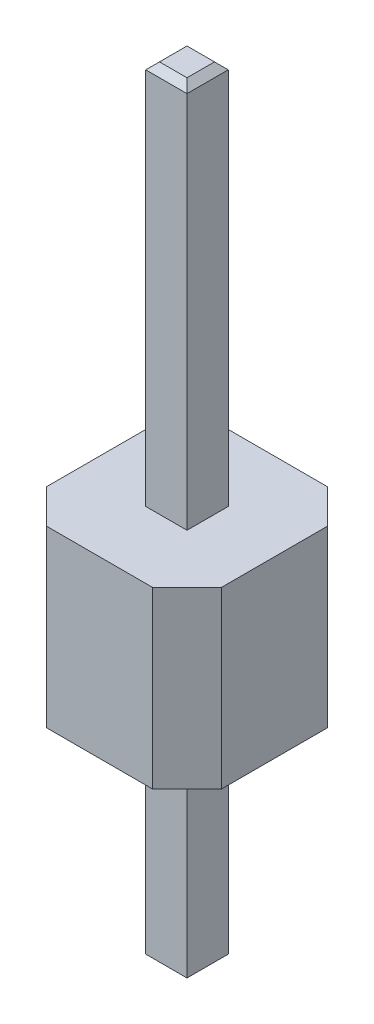
ISO-10303-21;
HEADER;
FILE_DESCRIPTION(('STEP AP214'),'2;1');
FILE_NAME('part.step','',(''),(''),'','','');
FILE_SCHEMA(('AUTOMOTIVE_DESIGN { 1 0 10303 214 1 1 1 1 }'));
ENDSEC;
DATA;
#1=APPLICATION_CONTEXT('core data for automotive mechanical design processes');
#2=APPLICATION_PROTOCOL_DEFINITION('international standard','automotive_design',2000,#1);
#3=PRODUCT_CONTEXT('',#1,'mechanical');
#4=PRODUCT('Part','Part','',(#3));
#5=PRODUCT_RELATED_PRODUCT_CATEGORY('part','',(#4));
#6=PRODUCT_DEFINITION_FORMATION('','',#4);
#7=PRODUCT_DEFINITION_CONTEXT('part definition',#1,'design');
#8=PRODUCT_DEFINITION('design','',#6,#7);
#9=PRODUCT_DEFINITION_SHAPE('','',#8);
#10=(LENGTH_UNIT() NAMED_UNIT(*) SI_UNIT(.MILLI.,.METRE.));
#11=(NAMED_UNIT(*) PLANE_ANGLE_UNIT() SI_UNIT($,.RADIAN.));
#12=(NAMED_UNIT(*) SI_UNIT($,.STERADIAN.) SOLID_ANGLE_UNIT());
#13=UNCERTAINTY_MEASURE_WITH_UNIT(LENGTH_MEASURE(1.E-05),#10,'distance_accuracy_value','');
#14=(GEOMETRIC_REPRESENTATION_CONTEXT(3) GLOBAL_UNCERTAINTY_ASSIGNED_CONTEXT((#13)) GLOBAL_UNIT_ASSIGNED_CONTEXT((#10,
#11,#12)) REPRESENTATION_CONTEXT('',''));
#15=CARTESIAN_POINT('',(0.,0.,0.));
#16=DIRECTION('',(0.,0.,1.));
#17=DIRECTION('',(1.,0.,0.));
#18=AXIS2_PLACEMENT_3D('',#15,#16,#17);
#19=CARTESIAN_POINT('',(0.,0.,0.));
#20=DIRECTION('',(0.,1.,0.));
#21=DIRECTION('',(0.,0.,1.));
#22=AXIS2_PLACEMENT_3D('',#19,#20,#21);
#23=PLANE('',#22);
#24=DIRECTION('',(1.,0.,0.));
#25=VECTOR('',#24,1.);
#26=CARTESIAN_POINT('',(-1.27,0.,1.27));
#27=LINE('',#26,#25);
#28=CARTESIAN_POINT('',(-0.770000000000001,0.,1.27));
#29=VERTEX_POINT('',#28);
#30=CARTESIAN_POINT('',(0.769999999999999,0.,1.27));
#31=VERTEX_POINT('',#30);
#32=EDGE_CURVE('E231',#29,#31,#27,.T.);
#33=ORIENTED_EDGE('',*,*,#32,.F.);
#34=DIRECTION('',(0.707106781186545,0.,0.70710678118655));
#35=VECTOR('',#34,1.);
#36=CARTESIAN_POINT('',(-0.770000000000001,0.,1.27));
#37=LINE('',#36,#35);
#38=CARTESIAN_POINT('',(-1.27,0.,0.769999999999995));
#39=VERTEX_POINT('',#38);
#40=EDGE_CURVE('E313',#29,#39,#37,.F.);
#41=ORIENTED_EDGE('',*,*,#40,.T.);
#42=DIRECTION('',(0.,0.,1.));
#43=VECTOR('',#42,1.);
#44=CARTESIAN_POINT('',(-1.27,0.,-1.27));
#45=LINE('',#44,#43);
#46=CARTESIAN_POINT('',(-1.27,0.,-0.77));
#47=VERTEX_POINT('',#46);
#48=EDGE_CURVE('E244',#47,#39,#45,.T.);
#49=ORIENTED_EDGE('',*,*,#48,.F.);
#50=DIRECTION('',(-0.70710678118655,0.,0.707106781186545));
#51=VECTOR('',#50,1.);
#52=CARTESIAN_POINT('',(-1.27,0.,-0.77));
#53=LINE('',#52,#51);
#54=CARTESIAN_POINT('',(-0.769999999999997,0.,-1.27));
#55=VERTEX_POINT('',#54);
#56=EDGE_CURVE('E311',#47,#55,#53,.F.);
#57=ORIENTED_EDGE('',*,*,#56,.T.);
#58=DIRECTION('',(-1.,0.,0.));
#59=VECTOR('',#58,1.);
#60=CARTESIAN_POINT('',(-1.27,0.,-1.27));
#61=LINE('',#60,#59);
#62=CARTESIAN_POINT('',(0.769999999999997,0.,-1.27));
#63=VERTEX_POINT('',#62);
#64=EDGE_CURVE('E242',#63,#55,#61,.T.);
#65=ORIENTED_EDGE('',*,*,#64,.F.);
#66=DIRECTION('',(-0.707106781186546,0.,-0.707106781186549));
#67=VECTOR('',#66,1.);
#68=CARTESIAN_POINT('',(0.769999999999998,0.,-1.27));
#69=LINE('',#68,#67);
#70=CARTESIAN_POINT('',(1.27,0.,-0.769999999999997));
#71=VERTEX_POINT('',#70);
#72=EDGE_CURVE('E309',#63,#71,#69,.F.);
#73=ORIENTED_EDGE('',*,*,#72,.T.);
#74=DIRECTION('',(0.,0.,-1.));
#75=VECTOR('',#74,1.);
#76=CARTESIAN_POINT('',(1.27,0.,-1.27));
#77=LINE('',#76,#75);
#78=CARTESIAN_POINT('',(1.27,0.,0.770000000000001));
#79=VERTEX_POINT('',#78);
#80=EDGE_CURVE('E227',#79,#71,#77,.T.);
#81=ORIENTED_EDGE('',*,*,#80,.F.);
#82=DIRECTION('',(0.707106781186549,0.,-0.707106781186546));
#83=VECTOR('',#82,1.);
#84=CARTESIAN_POINT('',(1.27,0.,0.770000000000001));
#85=LINE('',#84,#83);
#86=EDGE_CURVE('E307',#79,#31,#85,.F.);
#87=ORIENTED_EDGE('',*,*,#86,.T.);
#88=EDGE_LOOP('',(#33,#41,#49,#57,#65,#73,#81,#87));
#89=FACE_BOUND('',#88,.T.);
#90=DIRECTION('',(0.,0.,-1.));
#91=VECTOR('',#90,1.);
#92=CARTESIAN_POINT('',(-0.3,0.,-0.3));
#93=LINE('',#92,#91);
#94=CARTESIAN_POINT('',(-0.3,0.,0.3));
#95=VERTEX_POINT('',#94);
#96=CARTESIAN_POINT('',(-0.3,0.,-0.3));
#97=VERTEX_POINT('',#96);
#98=EDGE_CURVE('E176',#95,#97,#93,.T.);
#99=ORIENTED_EDGE('',*,*,#98,.F.);
#100=DIRECTION('',(-1.,0.,0.));
#101=VECTOR('',#100,1.);
#102=CARTESIAN_POINT('',(0.3,0.,0.3));
#103=LINE('',#102,#101);
#104=CARTESIAN_POINT('',(0.3,0.,0.3));
#105=VERTEX_POINT('',#104);
#106=EDGE_CURVE('E184',#105,#95,#103,.T.);
#107=ORIENTED_EDGE('',*,*,#106,.F.);
#108=DIRECTION('',(0.,0.,1.));
#109=VECTOR('',#108,1.);
#110=CARTESIAN_POINT('',(0.3,0.,-0.3));
#111=LINE('',#110,#109);
#112=CARTESIAN_POINT('',(0.3,0.,-0.3));
#113=VERTEX_POINT('',#112);
#114=EDGE_CURVE('E197',#113,#105,#111,.T.);
#115=ORIENTED_EDGE('',*,*,#114,.F.);
#116=DIRECTION('',(1.,0.,0.));
#117=VECTOR('',#116,1.);
#118=CARTESIAN_POINT('',(0.3,0.,-0.3));
#119=LINE('',#118,#117);
#120=EDGE_CURVE('E192',#97,#113,#119,.T.);
#121=ORIENTED_EDGE('',*,*,#120,.F.);
#122=EDGE_LOOP('',(#99,#107,#115,#121));
#123=FACE_BOUND('',#122,.T.);
#124=ADVANCED_FACE('F34',(#89,#123),#23,.F.);
#125=CARTESIAN_POINT('',(0.,2.54,0.));
#126=DIRECTION('',(0.,1.,0.));
#127=DIRECTION('',(0.,0.,1.));
#128=AXIS2_PLACEMENT_3D('',#125,#126,#127);
#129=PLANE('',#128);
#130=DIRECTION('',(0.,0.,1.));
#131=VECTOR('',#130,1.);
#132=CARTESIAN_POINT('',(-1.27,2.54,-1.27));
#133=LINE('',#132,#131);
#134=CARTESIAN_POINT('',(-1.27,2.54,-0.77));
#135=VERTEX_POINT('',#134);
#136=CARTESIAN_POINT('',(-1.27,2.54,0.769999999999995));
#137=VERTEX_POINT('',#136);
#138=EDGE_CURVE('E233',#135,#137,#133,.T.);
#139=ORIENTED_EDGE('',*,*,#138,.T.);
#140=DIRECTION('',(-0.707106781186545,0.,-0.70710678118655));
#141=VECTOR('',#140,1.);
#142=CARTESIAN_POINT('',(-1.02,2.54,1.02));
#143=LINE('',#142,#141);
#144=CARTESIAN_POINT('',(-0.770000000000001,2.54,1.27));
#145=VERTEX_POINT('',#144);
#146=EDGE_CURVE('E325',#137,#145,#143,.F.);
#147=ORIENTED_EDGE('',*,*,#146,.T.);
#148=DIRECTION('',(1.,0.,0.));
#149=VECTOR('',#148,1.);
#150=CARTESIAN_POINT('',(-1.27,2.54,1.27));
#151=LINE('',#150,#149);
#152=CARTESIAN_POINT('',(0.77,2.54,1.27));
#153=VERTEX_POINT('',#152);
#154=EDGE_CURVE('E236',#145,#153,#151,.T.);
#155=ORIENTED_EDGE('',*,*,#154,.T.);
#156=DIRECTION('',(-0.707106781186549,0.,0.707106781186546));
#157=VECTOR('',#156,1.);
#158=CARTESIAN_POINT('',(1.02,2.54,1.02));
#159=LINE('',#158,#157);
#160=CARTESIAN_POINT('',(1.27,2.54,0.770000000000001));
#161=VERTEX_POINT('',#160);
#162=EDGE_CURVE('E320',#153,#161,#159,.F.);
#163=ORIENTED_EDGE('',*,*,#162,.T.);
#164=DIRECTION('',(0.,0.,-1.));
#165=VECTOR('',#164,1.);
#166=CARTESIAN_POINT('',(1.27,2.54,-1.27));
#167=LINE('',#166,#165);
#168=CARTESIAN_POINT('',(1.27,2.54,-0.769999999999996));
#169=VERTEX_POINT('',#168);
#170=EDGE_CURVE('E228',#161,#169,#167,.T.);
#171=ORIENTED_EDGE('',*,*,#170,.T.);
#172=DIRECTION('',(0.707106781186546,0.,0.707106781186549));
#173=VECTOR('',#172,1.);
#174=CARTESIAN_POINT('',(1.02,2.54,-1.02));
#175=LINE('',#174,#173);
#176=CARTESIAN_POINT('',(0.769999999999997,2.54,-1.27));
#177=VERTEX_POINT('',#176);
#178=EDGE_CURVE('E56',#169,#177,#175,.F.);
#179=ORIENTED_EDGE('',*,*,#178,.T.);
#180=DIRECTION('',(-1.,0.,0.));
#181=VECTOR('',#180,1.);
#182=CARTESIAN_POINT('',(-1.27,2.54,-1.27));
#183=LINE('',#182,#181);
#184=CARTESIAN_POINT('',(-0.769999999999997,2.54,-1.27));
#185=VERTEX_POINT('',#184);
#186=EDGE_CURVE('E230',#177,#185,#183,.T.);
#187=ORIENTED_EDGE('',*,*,#186,.T.);
#188=DIRECTION('',(0.70710678118655,0.,-0.707106781186545));
#189=VECTOR('',#188,1.);
#190=CARTESIAN_POINT('',(-1.02,2.54,-1.02));
#191=LINE('',#190,#189);
#192=EDGE_CURVE('E323',#185,#135,#191,.F.);
#193=ORIENTED_EDGE('',*,*,#192,.T.);
#194=EDGE_LOOP('',(#139,#147,#155,#163,#171,#179,#187,#193));
#195=FACE_BOUND('',#194,.T.);
#196=DIRECTION('',(-1.,0.,0.));
#197=VECTOR('',#196,1.);
#198=CARTESIAN_POINT('',(-0.3,2.54,-0.3));
#199=LINE('',#198,#197);
#200=CARTESIAN_POINT('',(0.3,2.54,-0.3));
#201=VERTEX_POINT('',#200);
#202=CARTESIAN_POINT('',(-0.3,2.54,-0.3));
#203=VERTEX_POINT('',#202);
#204=EDGE_CURVE('E210',#201,#203,#199,.T.);
#205=ORIENTED_EDGE('',*,*,#204,.F.);
#206=DIRECTION('',(0.,0.,-1.));
#207=VECTOR('',#206,1.);
#208=CARTESIAN_POINT('',(0.3,2.54,-0.3));
#209=LINE('',#208,#207);
#210=CARTESIAN_POINT('',(0.3,2.54,0.3));
#211=VERTEX_POINT('',#210);
#212=EDGE_CURVE('E207',#211,#201,#209,.T.);
#213=ORIENTED_EDGE('',*,*,#212,.F.);
#214=DIRECTION('',(1.,0.,0.));
#215=VECTOR('',#214,1.);
#216=CARTESIAN_POINT('',(-0.3,2.54,0.3));
#217=LINE('',#216,#215);
#218=CARTESIAN_POINT('',(-0.3,2.54,0.3));
#219=VERTEX_POINT('',#218);
#220=EDGE_CURVE('E216',#219,#211,#217,.T.);
#221=ORIENTED_EDGE('',*,*,#220,.F.);
#222=DIRECTION('',(0.,0.,1.));
#223=VECTOR('',#222,1.);
#224=CARTESIAN_POINT('',(-0.3,2.54,-0.3));
#225=LINE('',#224,#223);
#226=EDGE_CURVE('E213',#203,#219,#225,.T.);
#227=ORIENTED_EDGE('',*,*,#226,.F.);
#228=EDGE_LOOP('',(#205,#213,#221,#227));
#229=FACE_BOUND('',#228,.T.);
#230=ADVANCED_FACE('F347',(#195,#229),#129,.T.);
#231=CARTESIAN_POINT('',(1.27,2.54,-1.27));
#232=DIRECTION('',(-1.,0.,0.));
#233=DIRECTION('',(0.,0.,1.));
#234=AXIS2_PLACEMENT_3D('',#231,#232,#233);
#235=PLANE('',#234);
#236=ORIENTED_EDGE('',*,*,#80,.T.);
#237=DIRECTION('',(0.,1.,0.));
#238=VECTOR('',#237,1.);
#239=CARTESIAN_POINT('',(1.27,2.54,-0.769999999999997));
#240=LINE('',#239,#238);
#241=EDGE_CURVE('E11',#71,#169,#240,.T.);
#242=ORIENTED_EDGE('',*,*,#241,.T.);
#243=ORIENTED_EDGE('',*,*,#170,.F.);
#244=DIRECTION('',(0.,-1.,0.));
#245=VECTOR('',#244,1.);
#246=CARTESIAN_POINT('',(1.27,2.54,0.770000000000001));
#247=LINE('',#246,#245);
#248=EDGE_CURVE('E42',#161,#79,#247,.T.);
#249=ORIENTED_EDGE('',*,*,#248,.T.);
#250=EDGE_LOOP('',(#236,#242,#243,#249));
#251=FACE_BOUND('',#250,.T.);
#252=ADVANCED_FACE('F335',(#251),#235,.F.);
#253=CARTESIAN_POINT('',(-1.27,2.54,-1.27));
#254=DIRECTION('',(0.,0.,1.));
#255=DIRECTION('',(1.,0.,0.));
#256=AXIS2_PLACEMENT_3D('',#253,#254,#255);
#257=PLANE('',#256);
#258=ORIENTED_EDGE('',*,*,#64,.T.);
#259=DIRECTION('',(0.,1.,0.));
#260=VECTOR('',#259,1.);
#261=CARTESIAN_POINT('',(-0.769999999999997,2.54,-1.27));
#262=LINE('',#261,#260);
#263=EDGE_CURVE('E49',#55,#185,#262,.T.);
#264=ORIENTED_EDGE('',*,*,#263,.T.);
#265=ORIENTED_EDGE('',*,*,#186,.F.);
#266=DIRECTION('',(0.,-1.,0.));
#267=VECTOR('',#266,1.);
#268=CARTESIAN_POINT('',(0.769999999999998,2.54,-1.27));
#269=LINE('',#268,#267);
#270=EDGE_CURVE('E327',#177,#63,#269,.T.);
#271=ORIENTED_EDGE('',*,*,#270,.T.);
#272=EDGE_LOOP('',(#258,#264,#265,#271));
#273=FACE_BOUND('',#272,.T.);
#274=ADVANCED_FACE('F345',(#273),#257,.F.);
#275=CARTESIAN_POINT('',(-1.27,2.54,-1.27));
#276=DIRECTION('',(1.,0.,0.));
#277=DIRECTION('',(0.,0.,-1.));
#278=AXIS2_PLACEMENT_3D('',#275,#276,#277);
#279=PLANE('',#278);
#280=ORIENTED_EDGE('',*,*,#48,.T.);
#281=DIRECTION('',(0.,1.,0.));
#282=VECTOR('',#281,1.);
#283=CARTESIAN_POINT('',(-1.27,2.54,0.769999999999995));
#284=LINE('',#283,#282);
#285=EDGE_CURVE('E318',#39,#137,#284,.T.);
#286=ORIENTED_EDGE('',*,*,#285,.T.);
#287=ORIENTED_EDGE('',*,*,#138,.F.);
#288=DIRECTION('',(0.,-1.,0.));
#289=VECTOR('',#288,1.);
#290=CARTESIAN_POINT('',(-1.27,2.54,-0.77));
#291=LINE('',#290,#289);
#292=EDGE_CURVE('E315',#135,#47,#291,.T.);
#293=ORIENTED_EDGE('',*,*,#292,.T.);
#294=EDGE_LOOP('',(#280,#286,#287,#293));
#295=FACE_BOUND('',#294,.T.);
#296=ADVANCED_FACE('F355',(#295),#279,.F.);
#297=CARTESIAN_POINT('',(-1.27,2.54,1.27));
#298=DIRECTION('',(0.,0.,-1.));
#299=DIRECTION('',(-1.,0.,0.));
#300=AXIS2_PLACEMENT_3D('',#297,#298,#299);
#301=PLANE('',#300);
#302=ORIENTED_EDGE('',*,*,#154,.F.);
#303=DIRECTION('',(0.,-1.,0.));
#304=VECTOR('',#303,1.);
#305=CARTESIAN_POINT('',(-0.770000000000001,2.54,1.27));
#306=LINE('',#305,#304);
#307=EDGE_CURVE('E304',#145,#29,#306,.T.);
#308=ORIENTED_EDGE('',*,*,#307,.T.);
#309=ORIENTED_EDGE('',*,*,#32,.T.);
#310=DIRECTION('',(0.,1.,0.));
#311=VECTOR('',#310,1.);
#312=CARTESIAN_POINT('',(0.77,2.54,1.27));
#313=LINE('',#312,#311);
#314=EDGE_CURVE('E282',#31,#153,#313,.T.);
#315=ORIENTED_EDGE('',*,*,#314,.T.);
#316=EDGE_LOOP('',(#302,#308,#309,#315));
#317=FACE_BOUND('',#316,.T.);
#318=ADVANCED_FACE('F363',(#317),#301,.F.);
#319=CARTESIAN_POINT('',(0.3,8.14,-0.3));
#320=DIRECTION('',(-1.,0.,0.));
#321=DIRECTION('',(0.,0.,1.));
#322=AXIS2_PLACEMENT_3D('',#319,#320,#321);
#323=PLANE('',#322);
#324=DIRECTION('',(0.,-1.,0.));
#325=VECTOR('',#324,1.);
#326=CARTESIAN_POINT('',(0.3,8.14,-0.3));
#327=LINE('',#326,#325);
#328=CARTESIAN_POINT('',(0.3,8.04,-0.3));
#329=VERTEX_POINT('',#328);
#330=EDGE_CURVE('E225',#329,#201,#327,.T.);
#331=ORIENTED_EDGE('',*,*,#330,.F.);
#332=DIRECTION('',(0.,0.,1.));
#333=VECTOR('',#332,1.);
#334=CARTESIAN_POINT('',(0.3,8.04,0.3));
#335=LINE('',#334,#333);
#336=CARTESIAN_POINT('',(0.3,8.04,0.3));
#337=VERTEX_POINT('',#336);
#338=EDGE_CURVE('E280',#329,#337,#335,.T.);
#339=ORIENTED_EDGE('',*,*,#338,.T.);
#340=DIRECTION('',(0.,-1.,0.));
#341=VECTOR('',#340,1.);
#342=CARTESIAN_POINT('',(0.3,8.14,0.3));
#343=LINE('',#342,#341);
#344=EDGE_CURVE('E219',#337,#211,#343,.T.);
#345=ORIENTED_EDGE('',*,*,#344,.T.);
#346=ORIENTED_EDGE('',*,*,#212,.T.);
#347=EDGE_LOOP('',(#331,#339,#345,#346));
#348=FACE_BOUND('',#347,.T.);
#349=ADVANCED_FACE('F384',(#348),#323,.F.);
#350=CARTESIAN_POINT('',(-0.3,8.14,-0.3));
#351=DIRECTION('',(0.,0.,1.));
#352=DIRECTION('',(1.,0.,0.));
#353=AXIS2_PLACEMENT_3D('',#350,#351,#352);
#354=PLANE('',#353);
#355=DIRECTION('',(0.,-1.,0.));
#356=VECTOR('',#355,1.);
#357=CARTESIAN_POINT('',(-0.3,8.14,-0.3));
#358=LINE('',#357,#356);
#359=CARTESIAN_POINT('',(-0.3,8.04,-0.3));
#360=VERTEX_POINT('',#359);
#361=EDGE_CURVE('E223',#360,#203,#358,.T.);
#362=ORIENTED_EDGE('',*,*,#361,.F.);
#363=DIRECTION('',(1.,0.,0.));
#364=VECTOR('',#363,1.);
#365=CARTESIAN_POINT('',(0.3,8.04,-0.3));
#366=LINE('',#365,#364);
#367=EDGE_CURVE('E278',#360,#329,#366,.T.);
#368=ORIENTED_EDGE('',*,*,#367,.T.);
#369=ORIENTED_EDGE('',*,*,#330,.T.);
#370=ORIENTED_EDGE('',*,*,#204,.T.);
#371=EDGE_LOOP('',(#362,#368,#369,#370));
#372=FACE_BOUND('',#371,.T.);
#373=ADVANCED_FACE('F494',(#372),#354,.F.);
#374=CARTESIAN_POINT('',(-0.3,8.14,-0.3));
#375=DIRECTION('',(1.,0.,0.));
#376=DIRECTION('',(0.,0.,-1.));
#377=AXIS2_PLACEMENT_3D('',#374,#375,#376);
#378=PLANE('',#377);
#379=DIRECTION('',(0.,-1.,0.));
#380=VECTOR('',#379,1.);
#381=CARTESIAN_POINT('',(-0.3,8.14,0.3));
#382=LINE('',#381,#380);
#383=CARTESIAN_POINT('',(-0.3,8.04,0.3));
#384=VERTEX_POINT('',#383);
#385=EDGE_CURVE('E221',#384,#219,#382,.T.);
#386=ORIENTED_EDGE('',*,*,#385,.F.);
#387=DIRECTION('',(0.,0.,-1.));
#388=VECTOR('',#387,1.);
#389=CARTESIAN_POINT('',(-0.3,8.04,-0.3));
#390=LINE('',#389,#388);
#391=EDGE_CURVE('E276',#384,#360,#390,.T.);
#392=ORIENTED_EDGE('',*,*,#391,.T.);
#393=ORIENTED_EDGE('',*,*,#361,.T.);
#394=ORIENTED_EDGE('',*,*,#226,.T.);
#395=EDGE_LOOP('',(#386,#392,#393,#394));
#396=FACE_BOUND('',#395,.T.);
#397=ADVANCED_FACE('F490',(#396),#378,.F.);
#398=CARTESIAN_POINT('',(-0.3,8.14,0.3));
#399=DIRECTION('',(0.,0.,-1.));
#400=DIRECTION('',(-1.,0.,0.));
#401=AXIS2_PLACEMENT_3D('',#398,#399,#400);
#402=PLANE('',#401);
#403=ORIENTED_EDGE('',*,*,#344,.F.);
#404=DIRECTION('',(-1.,0.,0.));
#405=VECTOR('',#404,1.);
#406=CARTESIAN_POINT('',(-0.3,8.04,0.3));
#407=LINE('',#406,#405);
#408=EDGE_CURVE('E273',#337,#384,#407,.T.);
#409=ORIENTED_EDGE('',*,*,#408,.T.);
#410=ORIENTED_EDGE('',*,*,#385,.T.);
#411=ORIENTED_EDGE('',*,*,#220,.T.);
#412=EDGE_LOOP('',(#403,#409,#410,#411));
#413=FACE_BOUND('',#412,.T.);
#414=ADVANCED_FACE('F486',(#413),#402,.F.);
#415=CARTESIAN_POINT('',(0.,8.14,0.));
#416=DIRECTION('',(0.,1.,0.));
#417=DIRECTION('',(0.,0.,1.));
#418=AXIS2_PLACEMENT_3D('',#415,#416,#417);
#419=PLANE('',#418);
#420=DIRECTION('',(0.,0.,1.));
#421=VECTOR('',#420,1.);
#422=CARTESIAN_POINT('',(-0.200000000000001,8.14,0.3));
#423=LINE('',#422,#421);
#424=CARTESIAN_POINT('',(-0.200000000000001,8.14,-0.200000000000001));
#425=VERTEX_POINT('',#424);
#426=CARTESIAN_POINT('',(-0.200000000000001,8.14,0.2));
#427=VERTEX_POINT('',#426);
#428=EDGE_CURVE('E268',#425,#427,#423,.T.);
#429=ORIENTED_EDGE('',*,*,#428,.T.);
#430=DIRECTION('',(1.,0.,0.));
#431=VECTOR('',#430,1.);
#432=CARTESIAN_POINT('',(0.3,8.14,0.2));
#433=LINE('',#432,#431);
#434=CARTESIAN_POINT('',(0.200000000000001,8.14,0.2));
#435=VERTEX_POINT('',#434);
#436=EDGE_CURVE('E270',#427,#435,#433,.T.);
#437=ORIENTED_EDGE('',*,*,#436,.T.);
#438=DIRECTION('',(0.,0.,-1.));
#439=VECTOR('',#438,1.);
#440=CARTESIAN_POINT('',(0.200000000000001,8.14,-0.3));
#441=LINE('',#440,#439);
#442=CARTESIAN_POINT('',(0.200000000000001,8.14,-0.200000000000001));
#443=VERTEX_POINT('',#442);
#444=EDGE_CURVE('E264',#435,#443,#441,.T.);
#445=ORIENTED_EDGE('',*,*,#444,.T.);
#446=DIRECTION('',(-1.,0.,0.));
#447=VECTOR('',#446,1.);
#448=CARTESIAN_POINT('',(-0.3,8.14,-0.200000000000001));
#449=LINE('',#448,#447);
#450=EDGE_CURVE('E266',#443,#425,#449,.T.);
#451=ORIENTED_EDGE('',*,*,#450,.T.);
#452=EDGE_LOOP('',(#429,#437,#445,#451));
#453=FACE_BOUND('',#452,.T.);
#454=ADVANCED_FACE('F483',(#453),#419,.T.);
#455=CARTESIAN_POINT('',(-0.3,-3.2,-0.3));
#456=DIRECTION('',(1.,0.,0.));
#457=DIRECTION('',(0.,0.,-1.));
#458=AXIS2_PLACEMENT_3D('',#455,#456,#457);
#459=PLANE('',#458);
#460=DIRECTION('',(0.,1.,0.));
#461=VECTOR('',#460,1.);
#462=CARTESIAN_POINT('',(-0.3,-3.2,-0.3));
#463=LINE('',#462,#461);
#464=CARTESIAN_POINT('',(-0.3,-3.1,-0.3));
#465=VERTEX_POINT('',#464);
#466=EDGE_CURVE('E205',#465,#97,#463,.T.);
#467=ORIENTED_EDGE('',*,*,#466,.F.);
#468=DIRECTION('',(0.,0.,1.));
#469=VECTOR('',#468,1.);
#470=CARTESIAN_POINT('',(-0.3,-3.1,0.3));
#471=LINE('',#470,#469);
#472=CARTESIAN_POINT('',(-0.3,-3.1,0.3));
#473=VERTEX_POINT('',#472);
#474=EDGE_CURVE('E178',#465,#473,#471,.T.);
#475=ORIENTED_EDGE('',*,*,#474,.T.);
#476=DIRECTION('',(0.,1.,0.));
#477=VECTOR('',#476,1.);
#478=CARTESIAN_POINT('',(-0.3,-3.2,0.3));
#479=LINE('',#478,#477);
#480=EDGE_CURVE('E172',#473,#95,#479,.T.);
#481=ORIENTED_EDGE('',*,*,#480,.T.);
#482=ORIENTED_EDGE('',*,*,#98,.T.);
#483=EDGE_LOOP('',(#467,#475,#481,#482));
#484=FACE_BOUND('',#483,.T.);
#485=ADVANCED_FACE('F175',(#484),#459,.F.);
#486=CARTESIAN_POINT('',(0.3,-3.2,-0.3));
#487=DIRECTION('',(0.,0.,1.));
#488=DIRECTION('',(1.,0.,0.));
#489=AXIS2_PLACEMENT_3D('',#486,#487,#488);
#490=PLANE('',#489);
#491=DIRECTION('',(0.,1.,0.));
#492=VECTOR('',#491,1.);
#493=CARTESIAN_POINT('',(0.3,-3.2,-0.3));
#494=LINE('',#493,#492);
#495=CARTESIAN_POINT('',(0.3,-3.1,-0.3));
#496=VERTEX_POINT('',#495);
#497=EDGE_CURVE('E203',#496,#113,#494,.T.);
#498=ORIENTED_EDGE('',*,*,#497,.F.);
#499=DIRECTION('',(-1.,0.,0.));
#500=VECTOR('',#499,1.);
#501=CARTESIAN_POINT('',(-0.3,-3.1,-0.3));
#502=LINE('',#501,#500);
#503=EDGE_CURVE('E261',#496,#465,#502,.T.);
#504=ORIENTED_EDGE('',*,*,#503,.T.);
#505=ORIENTED_EDGE('',*,*,#466,.T.);
#506=ORIENTED_EDGE('',*,*,#120,.T.);
#507=EDGE_LOOP('',(#498,#504,#505,#506));
#508=FACE_BOUND('',#507,.T.);
#509=ADVANCED_FACE('F476',(#508),#490,.F.);
#510=CARTESIAN_POINT('',(0.3,-3.2,-0.3));
#511=DIRECTION('',(-1.,0.,0.));
#512=DIRECTION('',(0.,0.,1.));
#513=AXIS2_PLACEMENT_3D('',#510,#511,#512);
#514=PLANE('',#513);
#515=DIRECTION('',(0.,1.,0.));
#516=VECTOR('',#515,1.);
#517=CARTESIAN_POINT('',(0.3,-3.2,0.3));
#518=LINE('',#517,#516);
#519=CARTESIAN_POINT('',(0.3,-3.1,0.3));
#520=VERTEX_POINT('',#519);
#521=EDGE_CURVE('E183',#520,#105,#518,.T.);
#522=ORIENTED_EDGE('',*,*,#521,.F.);
#523=DIRECTION('',(0.,0.,-1.));
#524=VECTOR('',#523,1.);
#525=CARTESIAN_POINT('',(0.3,-3.1,-0.3));
#526=LINE('',#525,#524);
#527=EDGE_CURVE('E259',#520,#496,#526,.T.);
#528=ORIENTED_EDGE('',*,*,#527,.T.);
#529=ORIENTED_EDGE('',*,*,#497,.T.);
#530=ORIENTED_EDGE('',*,*,#114,.T.);
#531=EDGE_LOOP('',(#522,#528,#529,#530));
#532=FACE_BOUND('',#531,.T.);
#533=ADVANCED_FACE('F473',(#532),#514,.F.);
#534=CARTESIAN_POINT('',(0.3,-3.2,0.3));
#535=DIRECTION('',(0.,0.,-1.));
#536=DIRECTION('',(-1.,0.,0.));
#537=AXIS2_PLACEMENT_3D('',#534,#535,#536);
#538=PLANE('',#537);
#539=ORIENTED_EDGE('',*,*,#480,.F.);
#540=DIRECTION('',(1.,0.,0.));
#541=VECTOR('',#540,1.);
#542=CARTESIAN_POINT('',(0.3,-3.1,0.3));
#543=LINE('',#542,#541);
#544=EDGE_CURVE('E257',#473,#520,#543,.T.);
#545=ORIENTED_EDGE('',*,*,#544,.T.);
#546=ORIENTED_EDGE('',*,*,#521,.T.);
#547=ORIENTED_EDGE('',*,*,#106,.T.);
#548=EDGE_LOOP('',(#539,#545,#546,#547));
#549=FACE_BOUND('',#548,.T.);
#550=ADVANCED_FACE('F195',(#549),#538,.F.);
#551=CARTESIAN_POINT('',(0.,-3.2,0.));
#552=DIRECTION('',(0.,-1.,0.));
#553=DIRECTION('',(0.,0.,-1.));
#554=AXIS2_PLACEMENT_3D('',#551,#552,#553);
#555=PLANE('',#554);
#556=CARTESIAN_POINT('',(0.,-3.2,0.));
#557=DIRECTION('',(0.,-1.,0.));
#558=DIRECTION('',(0.,0.,-1.));
#559=AXIS2_PLACEMENT_3D('',#556,#557,#558);
#560=CIRCLE('',#559,0.0418224519289995);
#561=CARTESIAN_POINT('',(0.,-3.2,-0.0418224519289995));
#562=VERTEX_POINT('',#561);
#563=EDGE_CURVE('E673',#562,#562,#560,.T.);
#564=ORIENTED_EDGE('',*,*,#563,.F.);
#565=EDGE_LOOP('',(#564));
#566=FACE_BOUND('',#565,.T.);
#567=DIRECTION('',(0.,0.,1.));
#568=VECTOR('',#567,1.);
#569=CARTESIAN_POINT('',(0.200000000000001,-3.2,0.3));
#570=LINE('',#569,#568);
#571=CARTESIAN_POINT('',(0.200000000000001,-3.2,-0.2));
#572=VERTEX_POINT('',#571);
#573=CARTESIAN_POINT('',(0.200000000000001,-3.2,0.2));
#574=VERTEX_POINT('',#573);
#575=EDGE_CURVE('E252',#572,#574,#570,.T.);
#576=ORIENTED_EDGE('',*,*,#575,.T.);
#577=DIRECTION('',(-1.,0.,0.));
#578=VECTOR('',#577,1.);
#579=CARTESIAN_POINT('',(-0.3,-3.2,0.2));
#580=LINE('',#579,#578);
#581=CARTESIAN_POINT('',(-0.200000000000001,-3.2,0.2));
#582=VERTEX_POINT('',#581);
#583=EDGE_CURVE('E254',#574,#582,#580,.T.);
#584=ORIENTED_EDGE('',*,*,#583,.T.);
#585=DIRECTION('',(0.,0.,-1.));
#586=VECTOR('',#585,1.);
#587=CARTESIAN_POINT('',(-0.200000000000001,-3.2,-0.3));
#588=LINE('',#587,#586);
#589=CARTESIAN_POINT('',(-0.200000000000001,-3.2,-0.2));
#590=VERTEX_POINT('',#589);
#591=EDGE_CURVE('E239',#582,#590,#588,.T.);
#592=ORIENTED_EDGE('',*,*,#591,.T.);
#593=DIRECTION('',(1.,0.,0.));
#594=VECTOR('',#593,1.);
#595=CARTESIAN_POINT('',(0.3,-3.2,-0.2));
#596=LINE('',#595,#594);
#597=EDGE_CURVE('E250',#590,#572,#596,.T.);
#598=ORIENTED_EDGE('',*,*,#597,.T.);
#599=EDGE_LOOP('',(#576,#584,#592,#598));
#600=FACE_BOUND('',#599,.T.);
#601=ADVANCED_FACE('F407',(#566,#600),#555,.T.);
#602=CARTESIAN_POINT('',(0.,-3.2,-0.2));
#603=DIRECTION('',(0.,-0.707106781186548,-0.707106781186548));
#604=DIRECTION('',(-1.,0.,0.));
#605=AXIS2_PLACEMENT_3D('',#602,#603,#604);
#606=PLANE('',#605);
#607=DIRECTION('',(0.577350269189626,-0.577350269189626,0.577350269189626));
#608=VECTOR('',#607,1.);
#609=CARTESIAN_POINT('',(-0.133333333333334,-3.26666666666667,-0.133333333333334));
#610=LINE('',#609,#608);
#611=EDGE_CURVE('E288',#465,#590,#610,.T.);
#612=ORIENTED_EDGE('',*,*,#611,.F.);
#613=ORIENTED_EDGE('',*,*,#503,.F.);
#614=DIRECTION('',(-0.577350269189626,-0.577350269189626,0.577350269189626));
#615=VECTOR('',#614,1.);
#616=CARTESIAN_POINT('',(0.133333333333334,-3.26666666666667,-0.133333333333334));
#617=LINE('',#616,#615);
#618=EDGE_CURVE('E193',#572,#496,#617,.F.);
#619=ORIENTED_EDGE('',*,*,#618,.F.);
#620=ORIENTED_EDGE('',*,*,#597,.F.);
#621=EDGE_LOOP('',(#612,#613,#619,#620));
#622=FACE_BOUND('',#621,.T.);
#623=ADVANCED_FACE('F403',(#622),#606,.T.);
#624=CARTESIAN_POINT('',(0.200000000000001,-3.2,0.));
#625=DIRECTION('',(0.707106781186548,-0.707106781186548,0.));
#626=DIRECTION('',(0.,0.,-1.));
#627=AXIS2_PLACEMENT_3D('',#624,#625,#626);
#628=PLANE('',#627);
#629=ORIENTED_EDGE('',*,*,#618,.T.);
#630=ORIENTED_EDGE('',*,*,#527,.F.);
#631=DIRECTION('',(-0.577350269189626,-0.577350269189626,-0.577350269189626));
#632=VECTOR('',#631,1.);
#633=CARTESIAN_POINT('',(0.133333333333334,-3.26666666666667,0.133333333333334));
#634=LINE('',#633,#632);
#635=EDGE_CURVE('E285',#574,#520,#634,.F.);
#636=ORIENTED_EDGE('',*,*,#635,.F.);
#637=ORIENTED_EDGE('',*,*,#575,.F.);
#638=EDGE_LOOP('',(#629,#630,#636,#637));
#639=FACE_BOUND('',#638,.T.);
#640=ADVANCED_FACE('F399',(#639),#628,.T.);
#641=CARTESIAN_POINT('',(-0.200000000000001,-3.2,0.));
#642=DIRECTION('',(-0.707106781186548,-0.707106781186548,0.));
#643=DIRECTION('',(0.,0.,1.));
#644=AXIS2_PLACEMENT_3D('',#641,#642,#643);
#645=PLANE('',#644);
#646=ORIENTED_EDGE('',*,*,#611,.T.);
#647=ORIENTED_EDGE('',*,*,#591,.F.);
#648=DIRECTION('',(-0.577350269189626,0.577350269189626,0.577350269189626));
#649=VECTOR('',#648,1.);
#650=CARTESIAN_POINT('',(-0.133333333333334,-3.26666666666667,0.133333333333334));
#651=LINE('',#650,#649);
#652=EDGE_CURVE('E283',#473,#582,#651,.F.);
#653=ORIENTED_EDGE('',*,*,#652,.F.);
#654=ORIENTED_EDGE('',*,*,#474,.F.);
#655=EDGE_LOOP('',(#646,#647,#653,#654));
#656=FACE_BOUND('',#655,.T.);
#657=ADVANCED_FACE('F395',(#656),#645,.T.);
#658=CARTESIAN_POINT('',(0.,-3.2,0.2));
#659=DIRECTION('',(0.,-0.707106781186548,0.707106781186548));
#660=DIRECTION('',(1.,0.,0.));
#661=AXIS2_PLACEMENT_3D('',#658,#659,#660);
#662=PLANE('',#661);
#663=ORIENTED_EDGE('',*,*,#635,.T.);
#664=ORIENTED_EDGE('',*,*,#544,.F.);
#665=ORIENTED_EDGE('',*,*,#652,.T.);
#666=ORIENTED_EDGE('',*,*,#583,.F.);
#667=EDGE_LOOP('',(#663,#664,#665,#666));
#668=FACE_BOUND('',#667,.T.);
#669=ADVANCED_FACE('F391',(#668),#662,.T.);
#670=CARTESIAN_POINT('',(0.,8.14,-0.200000000000001));
#671=DIRECTION('',(0.,0.707106781186548,-0.707106781186548));
#672=DIRECTION('',(1.,0.,0.));
#673=AXIS2_PLACEMENT_3D('',#670,#671,#672);
#674=PLANE('',#673);
#675=DIRECTION('',(-0.577350269189626,0.577350269189626,0.577350269189626));
#676=VECTOR('',#675,1.);
#677=CARTESIAN_POINT('',(0.133333333333334,8.20666666666667,-0.133333333333334));
#678=LINE('',#677,#676);
#679=EDGE_CURVE('E298',#329,#443,#678,.T.);
#680=ORIENTED_EDGE('',*,*,#679,.F.);
#681=ORIENTED_EDGE('',*,*,#367,.F.);
#682=DIRECTION('',(0.577350269189626,0.577350269189626,0.577350269189626));
#683=VECTOR('',#682,1.);
#684=CARTESIAN_POINT('',(-0.133333333333334,8.20666666666667,-0.133333333333334));
#685=LINE('',#684,#683);
#686=EDGE_CURVE('E286',#425,#360,#685,.F.);
#687=ORIENTED_EDGE('',*,*,#686,.F.);
#688=ORIENTED_EDGE('',*,*,#450,.F.);
#689=EDGE_LOOP('',(#680,#681,#687,#688));
#690=FACE_BOUND('',#689,.T.);
#691=ADVANCED_FACE('F394',(#690),#674,.T.);
#692=CARTESIAN_POINT('',(-0.200000000000001,8.14,0.));
#693=DIRECTION('',(-0.707106781186548,0.707106781186548,0.));
#694=DIRECTION('',(0.,0.,-1.));
#695=AXIS2_PLACEMENT_3D('',#692,#693,#694);
#696=PLANE('',#695);
#697=ORIENTED_EDGE('',*,*,#686,.T.);
#698=ORIENTED_EDGE('',*,*,#391,.F.);
#699=DIRECTION('',(0.577350269189626,0.577350269189626,-0.577350269189626));
#700=VECTOR('',#699,1.);
#701=CARTESIAN_POINT('',(-0.133333333333334,8.20666666666667,0.133333333333334));
#702=LINE('',#701,#700);
#703=EDGE_CURVE('E295',#427,#384,#702,.F.);
#704=ORIENTED_EDGE('',*,*,#703,.F.);
#705=ORIENTED_EDGE('',*,*,#428,.F.);
#706=EDGE_LOOP('',(#697,#698,#704,#705));
#707=FACE_BOUND('',#706,.T.);
#708=ADVANCED_FACE('F416',(#707),#696,.T.);
#709=CARTESIAN_POINT('',(0.200000000000001,8.14,0.));
#710=DIRECTION('',(0.707106781186548,0.707106781186548,0.));
#711=DIRECTION('',(0.,0.,1.));
#712=AXIS2_PLACEMENT_3D('',#709,#710,#711);
#713=PLANE('',#712);
#714=ORIENTED_EDGE('',*,*,#679,.T.);
#715=ORIENTED_EDGE('',*,*,#444,.F.);
#716=DIRECTION('',(0.577350269189626,-0.577350269189626,0.577350269189626));
#717=VECTOR('',#716,1.);
#718=CARTESIAN_POINT('',(0.133333333333334,8.20666666666667,0.133333333333334));
#719=LINE('',#718,#717);
#720=EDGE_CURVE('E293',#337,#435,#719,.F.);
#721=ORIENTED_EDGE('',*,*,#720,.F.);
#722=ORIENTED_EDGE('',*,*,#338,.F.);
#723=EDGE_LOOP('',(#714,#715,#721,#722));
#724=FACE_BOUND('',#723,.T.);
#725=ADVANCED_FACE('F412',(#724),#713,.T.);
#726=CARTESIAN_POINT('',(0.,8.14,0.2));
#727=DIRECTION('',(0.,0.707106781186548,0.707106781186548));
#728=DIRECTION('',(-1.,0.,0.));
#729=AXIS2_PLACEMENT_3D('',#726,#727,#728);
#730=PLANE('',#729);
#731=ORIENTED_EDGE('',*,*,#703,.T.);
#732=ORIENTED_EDGE('',*,*,#408,.F.);
#733=ORIENTED_EDGE('',*,*,#720,.T.);
#734=ORIENTED_EDGE('',*,*,#436,.F.);
#735=EDGE_LOOP('',(#731,#732,#733,#734));
#736=FACE_BOUND('',#735,.T.);
#737=ADVANCED_FACE('F409',(#736),#730,.T.);
#738=CARTESIAN_POINT('',(-0.770000000000001,2.54,1.27));
#739=DIRECTION('',(0.70710678118655,0.,-0.707106781186545));
#740=DIRECTION('',(0.,-1.,0.));
#741=AXIS2_PLACEMENT_3D('',#738,#739,#740);
#742=PLANE('',#741);
#743=ORIENTED_EDGE('',*,*,#146,.F.);
#744=ORIENTED_EDGE('',*,*,#285,.F.);
#745=ORIENTED_EDGE('',*,*,#40,.F.);
#746=ORIENTED_EDGE('',*,*,#307,.F.);
#747=EDGE_LOOP('',(#743,#744,#745,#746));
#748=FACE_BOUND('',#747,.T.);
#749=ADVANCED_FACE('F360',(#748),#742,.F.);
#750=CARTESIAN_POINT('',(-1.27,2.54,-0.77));
#751=DIRECTION('',(0.707106781186545,0.,0.70710678118655));
#752=DIRECTION('',(0.,-1.,0.));
#753=AXIS2_PLACEMENT_3D('',#750,#751,#752);
#754=PLANE('',#753);
#755=ORIENTED_EDGE('',*,*,#192,.F.);
#756=ORIENTED_EDGE('',*,*,#263,.F.);
#757=ORIENTED_EDGE('',*,*,#56,.F.);
#758=ORIENTED_EDGE('',*,*,#292,.F.);
#759=EDGE_LOOP('',(#755,#756,#757,#758));
#760=FACE_BOUND('',#759,.T.);
#761=ADVANCED_FACE('F352',(#760),#754,.F.);
#762=CARTESIAN_POINT('',(0.769999999999998,2.54,-1.27));
#763=DIRECTION('',(-0.707106781186549,0.,0.707106781186546));
#764=DIRECTION('',(0.,-1.,0.));
#765=AXIS2_PLACEMENT_3D('',#762,#763,#764);
#766=PLANE('',#765);
#767=ORIENTED_EDGE('',*,*,#178,.F.);
#768=ORIENTED_EDGE('',*,*,#241,.F.);
#769=ORIENTED_EDGE('',*,*,#72,.F.);
#770=ORIENTED_EDGE('',*,*,#270,.F.);
#771=EDGE_LOOP('',(#767,#768,#769,#770));
#772=FACE_BOUND('',#771,.T.);
#773=ADVANCED_FACE('F344',(#772),#766,.F.);
#774=CARTESIAN_POINT('',(1.27,2.54,0.770000000000001));
#775=DIRECTION('',(-0.707106781186546,0.,-0.707106781186549));
#776=DIRECTION('',(0.,-1.,0.));
#777=AXIS2_PLACEMENT_3D('',#774,#775,#776);
#778=PLANE('',#777);
#779=ORIENTED_EDGE('',*,*,#162,.F.);
#780=ORIENTED_EDGE('',*,*,#314,.F.);
#781=ORIENTED_EDGE('',*,*,#86,.F.);
#782=ORIENTED_EDGE('',*,*,#248,.F.);
#783=EDGE_LOOP('',(#779,#780,#781,#782));
#784=FACE_BOUND('',#783,.T.);
#785=ADVANCED_FACE('F36',(#784),#778,.F.);
#786=CARTESIAN_POINT('',(0.,6.8,0.));
#787=DIRECTION('',(0.,-1.,0.));
#788=DIRECTION('',(0.,0.,-1.));
#789=AXIS2_PLACEMENT_3D('',#786,#787,#788);
#790=CYLINDRICAL_SURFACE('',#789,0.0418224519289995);
#791=CARTESIAN_POINT('',(0.,6.8,0.));
#792=DIRECTION('',(0.,-1.,0.));
#793=DIRECTION('',(0.,0.,-1.));
#794=AXIS2_PLACEMENT_3D('',#791,#792,#793);
#795=CIRCLE('',#794,0.0418224519289995);
#796=CARTESIAN_POINT('',(0.,6.8,-0.0418224519289995));
#797=VERTEX_POINT('',#796);
#798=EDGE_CURVE('E296',#797,#797,#795,.T.);
#799=ORIENTED_EDGE('',*,*,#798,.F.);
#800=EDGE_LOOP('',(#799));
#801=FACE_BOUND('',#800,.T.);
#802=ORIENTED_EDGE('',*,*,#563,.T.);
#803=EDGE_LOOP('',(#802));
#804=FACE_BOUND('',#803,.T.);
#805=ADVANCED_FACE('F366',(#801,#804),#790,.F.);
#806=CARTESIAN_POINT('',(0.,6.8,0.));
#807=DIRECTION('',(0.,-1.,0.));
#808=DIRECTION('',(0.,0.,-1.));
#809=AXIS2_PLACEMENT_3D('',#806,#807,#808);
#810=PLANE('',#809);
#811=ORIENTED_EDGE('',*,*,#798,.T.);
#812=EDGE_LOOP('',(#811));
#813=FACE_BOUND('',#812,.T.);
#814=ADVANCED_FACE('F371',(#813),#810,.T.);
#815=CLOSED_SHELL('',(#124,#230,#252,#274,#296,#318,#349,#373,#397,#414,#454,#485,#509,#533,
#550,#601,#623,#640,#657,#669,#691,#708,#725,#737,#749,#761,#773,#785,#805,#814));
#816=MANIFOLD_SOLID_BREP('B2',#815);
#817=ADVANCED_BREP_SHAPE_REPRESENTATION('',(#18,#816),#14);
#818=SHAPE_DEFINITION_REPRESENTATION(#9,#817);
ENDSEC;
END-ISO-10303-21;
